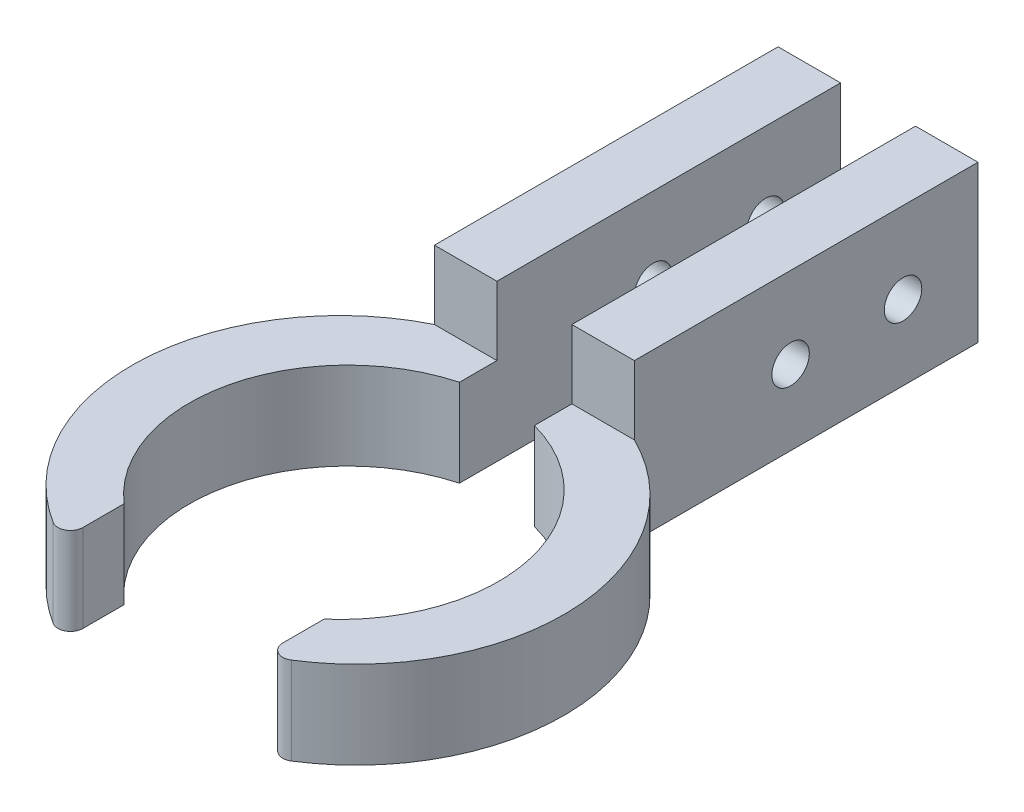
ISO-10303-21;
HEADER;
FILE_DESCRIPTION(('STEP AP214'),'2;1');
FILE_NAME('part.step','',(''),(''),'','','');
FILE_SCHEMA(('AUTOMOTIVE_DESIGN { 1 0 10303 214 1 1 1 1 }'));
ENDSEC;
DATA;
#1=APPLICATION_CONTEXT('core data for automotive mechanical design processes');
#2=APPLICATION_PROTOCOL_DEFINITION('international standard','automotive_design',2000,#1);
#3=PRODUCT_CONTEXT('',#1,'mechanical');
#4=PRODUCT('Part','Part','',(#3));
#5=PRODUCT_RELATED_PRODUCT_CATEGORY('part','',(#4));
#6=PRODUCT_DEFINITION_FORMATION('','',#4);
#7=PRODUCT_DEFINITION_CONTEXT('part definition',#1,'design');
#8=PRODUCT_DEFINITION('design','',#6,#7);
#9=PRODUCT_DEFINITION_SHAPE('','',#8);
#10=(LENGTH_UNIT() NAMED_UNIT(*) SI_UNIT(.MILLI.,.METRE.));
#11=(NAMED_UNIT(*) PLANE_ANGLE_UNIT() SI_UNIT($,.RADIAN.));
#12=(NAMED_UNIT(*) SI_UNIT($,.STERADIAN.) SOLID_ANGLE_UNIT());
#13=UNCERTAINTY_MEASURE_WITH_UNIT(LENGTH_MEASURE(1.E-05),#10,'distance_accuracy_value','');
#14=(GEOMETRIC_REPRESENTATION_CONTEXT(3) GLOBAL_UNCERTAINTY_ASSIGNED_CONTEXT((#13)) GLOBAL_UNIT_ASSIGNED_CONTEXT((#10,
#11,#12)) REPRESENTATION_CONTEXT('',''));
#15=CARTESIAN_POINT('',(0.,0.,0.));
#16=DIRECTION('',(0.,0.,1.));
#17=DIRECTION('',(1.,0.,0.));
#18=AXIS2_PLACEMENT_3D('',#15,#16,#17);
#19=CARTESIAN_POINT('',(5.18550460935479,7.,29.));
#20=DIRECTION('',(0.,-1.,0.));
#21=DIRECTION('',(0.,0.,-1.));
#22=AXIS2_PLACEMENT_3D('',#19,#20,#21);
#23=PLANE('',#22);
#24=DIRECTION('',(0.,0.,1.));
#25=VECTOR('',#24,1.);
#26=CARTESIAN_POINT('',(13.5,7.,38.5873638761418));
#27=LINE('',#26,#25);
#28=CARTESIAN_POINT('',(13.5,7.,38.5873638761418));
#29=VERTEX_POINT('',#28);
#30=CARTESIAN_POINT('',(13.5,7.,41.8828755037194));
#31=VERTEX_POINT('',#30);
#32=EDGE_CURVE('E156',#29,#31,#27,.T.);
#33=ORIENTED_EDGE('',*,*,#32,.T.);
#34=CARTESIAN_POINT('',(14.5,7.,41.8828755037194));
#35=DIRECTION('',(0.,-1.,0.));
#36=DIRECTION('',(0.,0.,-1.));
#37=AXIS2_PLACEMENT_3D('',#34,#35,#36);
#38=CIRCLE('',#37,1.);
#39=CARTESIAN_POINT('',(15.0340292748138,7.,42.7283414898134));
#40=VERTEX_POINT('',#39);
#41=EDGE_CURVE('E12',#31,#40,#38,.F.);
#42=ORIENTED_EDGE('',*,*,#41,.T.);
#43=CARTESIAN_POINT('',(6.15340022759102,7.,28.6686819380709));
#44=DIRECTION('',(0.,1.,0.));
#45=DIRECTION('',(0.,0.,-1.));
#46=AXIS2_PLACEMENT_3D('',#43,#44,#45);
#47=CIRCLE('',#46,16.6294798170382);
#48=CARTESIAN_POINT('',(13.5,7.,13.75));
#49=VERTEX_POINT('',#48);
#50=EDGE_CURVE('E159',#40,#49,#47,.T.);
#51=ORIENTED_EDGE('',*,*,#50,.T.);
#52=DIRECTION('',(1.,0.,0.));
#53=VECTOR('',#52,1.);
#54=CARTESIAN_POINT('',(13.5,7.,13.75));
#55=LINE('',#54,#53);
#56=CARTESIAN_POINT('',(8.50000000000001,7.,13.75));
#57=VERTEX_POINT('',#56);
#58=EDGE_CURVE('E136',#57,#49,#55,.T.);
#59=ORIENTED_EDGE('',*,*,#58,.F.);
#60=DIRECTION('',(0.,0.,1.));
#61=VECTOR('',#60,1.);
#62=CARTESIAN_POINT('',(8.50000000000001,7.,13.75));
#63=LINE('',#62,#61);
#64=CARTESIAN_POINT('',(8.50000000000001,7.,16.75));
#65=VERTEX_POINT('',#64);
#66=EDGE_CURVE('E161',#57,#65,#63,.T.);
#67=ORIENTED_EDGE('',*,*,#66,.T.);
#68=CARTESIAN_POINT('',(5.18550460935479,7.,29.));
#69=DIRECTION('',(0.,-1.,0.));
#70=DIRECTION('',(0.,0.,-1.));
#71=AXIS2_PLACEMENT_3D('',#68,#69,#70);
#72=CIRCLE('',#71,12.6904838242917);
#73=EDGE_CURVE('E153',#65,#29,#72,.T.);
#74=ORIENTED_EDGE('',*,*,#73,.T.);
#75=EDGE_LOOP('',(#33,#42,#51,#59,#67,#74));
#76=FACE_BOUND('',#75,.T.);
#77=ADVANCED_FACE('F43',(#76),#23,.F.);
#78=CARTESIAN_POINT('',(5.18550460935479,7.,29.));
#79=DIRECTION('',(0.,-1.,0.));
#80=DIRECTION('',(0.,0.,-1.));
#81=AXIS2_PLACEMENT_3D('',#78,#79,#80);
#82=CYLINDRICAL_SURFACE('',#81,12.6904838242917);
#83=CARTESIAN_POINT('',(5.18550460935479,0.,29.));
#84=DIRECTION('',(0.,-1.,0.));
#85=DIRECTION('',(0.,0.,-1.));
#86=AXIS2_PLACEMENT_3D('',#83,#84,#85);
#87=CIRCLE('',#86,12.6904838242917);
#88=CARTESIAN_POINT('',(8.50000000000001,0.,16.75));
#89=VERTEX_POINT('',#88);
#90=CARTESIAN_POINT('',(13.5,0.,38.5873638761418));
#91=VERTEX_POINT('',#90);
#92=EDGE_CURVE('E152',#89,#91,#87,.T.);
#93=ORIENTED_EDGE('',*,*,#92,.T.);
#94=DIRECTION('',(0.,-1.,0.));
#95=VECTOR('',#94,1.);
#96=CARTESIAN_POINT('',(13.5,7.,38.5873638761418));
#97=LINE('',#96,#95);
#98=EDGE_CURVE('E178',#29,#91,#97,.T.);
#99=ORIENTED_EDGE('',*,*,#98,.F.);
#100=ORIENTED_EDGE('',*,*,#73,.F.);
#101=DIRECTION('',(0.,-1.,0.));
#102=VECTOR('',#101,1.);
#103=CARTESIAN_POINT('',(8.50000000000001,7.,16.75));
#104=LINE('',#103,#102);
#105=EDGE_CURVE('E163',#65,#89,#104,.T.);
#106=ORIENTED_EDGE('',*,*,#105,.T.);
#107=EDGE_LOOP('',(#93,#99,#100,#106));
#108=FACE_BOUND('',#107,.T.);
#109=ADVANCED_FACE('F216',(#108),#82,.F.);
#110=CARTESIAN_POINT('',(13.5,7.,38.5873638761418));
#111=DIRECTION('',(1.,0.,0.));
#112=DIRECTION('',(0.,0.,-1.));
#113=AXIS2_PLACEMENT_3D('',#110,#111,#112);
#114=PLANE('',#113);
#115=DIRECTION('',(0.,0.,1.));
#116=VECTOR('',#115,1.);
#117=CARTESIAN_POINT('',(13.5,0.,38.5873638761418));
#118=LINE('',#117,#116);
#119=CARTESIAN_POINT('',(13.5,0.,41.8828755037194));
#120=VERTEX_POINT('',#119);
#121=EDGE_CURVE('E166',#91,#120,#118,.T.);
#122=ORIENTED_EDGE('',*,*,#121,.T.);
#123=DIRECTION('',(0.,-1.,0.));
#124=VECTOR('',#123,1.);
#125=CARTESIAN_POINT('',(13.5,7.,41.8828755037194));
#126=LINE('',#125,#124);
#127=EDGE_CURVE('E51',#120,#31,#126,.F.);
#128=ORIENTED_EDGE('',*,*,#127,.T.);
#129=ORIENTED_EDGE('',*,*,#32,.F.);
#130=ORIENTED_EDGE('',*,*,#98,.T.);
#131=EDGE_LOOP('',(#122,#128,#129,#130));
#132=FACE_BOUND('',#131,.T.);
#133=ADVANCED_FACE('F221',(#132),#114,.F.);
#134=CARTESIAN_POINT('',(6.15340022759102,7.,28.6686819380709));
#135=DIRECTION('',(0.,-1.,0.));
#136=DIRECTION('',(0.,0.,-1.));
#137=AXIS2_PLACEMENT_3D('',#134,#135,#136);
#138=CYLINDRICAL_SURFACE('',#137,16.6294798170382);
#139=ORIENTED_EDGE('',*,*,#50,.F.);
#140=DIRECTION('',(0.,-1.,0.));
#141=VECTOR('',#140,1.);
#142=CARTESIAN_POINT('',(15.0340292748138,7.,42.7283414898134));
#143=LINE('',#142,#141);
#144=CARTESIAN_POINT('',(15.0340292748138,0.,42.7283414898134));
#145=VERTEX_POINT('',#144);
#146=EDGE_CURVE('E181',#40,#145,#143,.T.);
#147=ORIENTED_EDGE('',*,*,#146,.T.);
#148=CARTESIAN_POINT('',(6.15340022759102,0.,28.6686819380709));
#149=DIRECTION('',(0.,1.,0.));
#150=DIRECTION('',(0.,0.,-1.));
#151=AXIS2_PLACEMENT_3D('',#148,#149,#150);
#152=CIRCLE('',#151,16.6294798170382);
#153=CARTESIAN_POINT('',(13.5,0.,13.75));
#154=VERTEX_POINT('',#153);
#155=EDGE_CURVE('E168',#145,#154,#152,.T.);
#156=ORIENTED_EDGE('',*,*,#155,.T.);
#157=DIRECTION('',(0.,-1.,0.));
#158=VECTOR('',#157,1.);
#159=CARTESIAN_POINT('',(13.5,7.,13.75));
#160=LINE('',#159,#158);
#161=EDGE_CURVE('E121',#49,#154,#160,.T.);
#162=ORIENTED_EDGE('',*,*,#161,.F.);
#163=EDGE_LOOP('',(#139,#147,#156,#162));
#164=FACE_BOUND('',#163,.T.);
#165=ADVANCED_FACE('F193',(#164),#138,.T.);
#166=CARTESIAN_POINT('',(13.5,7.,13.75));
#167=DIRECTION('',(-1.,0.,0.));
#168=DIRECTION('',(0.,0.,1.));
#169=AXIS2_PLACEMENT_3D('',#166,#167,#168);
#170=PLANE('',#169);
#171=CARTESIAN_POINT('',(13.5,6.,-7.75));
#172=DIRECTION('',(1.,0.,0.));
#173=DIRECTION('',(0.,0.,-1.));
#174=AXIS2_PLACEMENT_3D('',#171,#172,#173);
#175=CIRCLE('',#174,1.5);
#176=CARTESIAN_POINT('',(13.5,6.,-9.25));
#177=VERTEX_POINT('',#176);
#178=EDGE_CURVE('E185',#177,#177,#175,.T.);
#179=ORIENTED_EDGE('',*,*,#178,.F.);
#180=EDGE_LOOP('',(#179));
#181=FACE_BOUND('',#180,.T.);
#182=CARTESIAN_POINT('',(13.5,6.,1.25));
#183=DIRECTION('',(1.,0.,0.));
#184=DIRECTION('',(0.,0.,-1.));
#185=AXIS2_PLACEMENT_3D('',#182,#183,#184);
#186=CIRCLE('',#185,1.5);
#187=CARTESIAN_POINT('',(13.5,6.,-0.250000000000001));
#188=VERTEX_POINT('',#187);
#189=EDGE_CURVE('E142',#188,#188,#186,.T.);
#190=ORIENTED_EDGE('',*,*,#189,.F.);
#191=EDGE_LOOP('',(#190));
#192=FACE_BOUND('',#191,.T.);
#193=DIRECTION('',(0.,0.,-1.));
#194=VECTOR('',#193,1.);
#195=CARTESIAN_POINT('',(13.5,0.,13.75));
#196=LINE('',#195,#194);
#197=CARTESIAN_POINT('',(13.5,0.,-13.75));
#198=VERTEX_POINT('',#197);
#199=EDGE_CURVE('E117',#154,#198,#196,.T.);
#200=ORIENTED_EDGE('',*,*,#199,.T.);
#201=DIRECTION('',(0.,-1.,0.));
#202=VECTOR('',#201,1.);
#203=CARTESIAN_POINT('',(13.5,7.,-13.75));
#204=LINE('',#203,#202);
#205=CARTESIAN_POINT('',(13.5,12.5,-13.75));
#206=VERTEX_POINT('',#205);
#207=EDGE_CURVE('E109',#206,#198,#204,.T.);
#208=ORIENTED_EDGE('',*,*,#207,.F.);
#209=DIRECTION('',(0.,0.,-1.));
#210=VECTOR('',#209,1.);
#211=CARTESIAN_POINT('',(13.5,12.5,13.75));
#212=LINE('',#211,#210);
#213=CARTESIAN_POINT('',(13.5,12.5,13.75));
#214=VERTEX_POINT('',#213);
#215=EDGE_CURVE('E114',#214,#206,#212,.T.);
#216=ORIENTED_EDGE('',*,*,#215,.F.);
#217=DIRECTION('',(0.,-1.,0.));
#218=VECTOR('',#217,1.);
#219=CARTESIAN_POINT('',(13.5,12.5,13.75));
#220=LINE('',#219,#218);
#221=EDGE_CURVE('E146',#214,#49,#220,.T.);
#222=ORIENTED_EDGE('',*,*,#221,.T.);
#223=ORIENTED_EDGE('',*,*,#161,.T.);
#224=EDGE_LOOP('',(#200,#208,#216,#222,#223));
#225=FACE_BOUND('',#224,.T.);
#226=ADVANCED_FACE('F111',(#181,#192,#225),#170,.F.);
#227=CARTESIAN_POINT('',(13.5,7.,-13.75));
#228=DIRECTION('',(0.,0.,1.));
#229=DIRECTION('',(1.,0.,0.));
#230=AXIS2_PLACEMENT_3D('',#227,#228,#229);
#231=PLANE('',#230);
#232=DIRECTION('',(-1.,0.,0.));
#233=VECTOR('',#232,1.);
#234=CARTESIAN_POINT('',(13.5,0.,-13.75));
#235=LINE('',#234,#233);
#236=CARTESIAN_POINT('',(8.5,0.,-13.75));
#237=VERTEX_POINT('',#236);
#238=EDGE_CURVE('E171',#198,#237,#235,.T.);
#239=ORIENTED_EDGE('',*,*,#238,.T.);
#240=DIRECTION('',(0.,-1.,0.));
#241=VECTOR('',#240,1.);
#242=CARTESIAN_POINT('',(8.5,7.,-13.75));
#243=LINE('',#242,#241);
#244=CARTESIAN_POINT('',(8.5,12.5,-13.75));
#245=VERTEX_POINT('',#244);
#246=EDGE_CURVE('E122',#245,#237,#243,.T.);
#247=ORIENTED_EDGE('',*,*,#246,.F.);
#248=DIRECTION('',(-1.,0.,0.));
#249=VECTOR('',#248,1.);
#250=CARTESIAN_POINT('',(13.5,12.5,-13.75));
#251=LINE('',#250,#249);
#252=EDGE_CURVE('E125',#206,#245,#251,.T.);
#253=ORIENTED_EDGE('',*,*,#252,.F.);
#254=ORIENTED_EDGE('',*,*,#207,.T.);
#255=EDGE_LOOP('',(#239,#247,#253,#254));
#256=FACE_BOUND('',#255,.T.);
#257=ADVANCED_FACE('F126',(#256),#231,.F.);
#258=CARTESIAN_POINT('',(8.50000000000001,7.,13.75));
#259=DIRECTION('',(1.,0.,0.));
#260=DIRECTION('',(0.,0.,-1.));
#261=AXIS2_PLACEMENT_3D('',#258,#259,#260);
#262=PLANE('',#261);
#263=CARTESIAN_POINT('',(8.50000000000001,6.,-7.75));
#264=DIRECTION('',(1.,0.,0.));
#265=DIRECTION('',(0.,0.,-1.));
#266=AXIS2_PLACEMENT_3D('',#263,#264,#265);
#267=CIRCLE('',#266,1.5);
#268=CARTESIAN_POINT('',(8.50000000000001,6.,-9.25));
#269=VERTEX_POINT('',#268);
#270=EDGE_CURVE('E139',#269,#269,#267,.T.);
#271=ORIENTED_EDGE('',*,*,#270,.T.);
#272=EDGE_LOOP('',(#271));
#273=FACE_BOUND('',#272,.T.);
#274=CARTESIAN_POINT('',(8.50000000000001,6.,1.25));
#275=DIRECTION('',(1.,0.,0.));
#276=DIRECTION('',(0.,0.,-1.));
#277=AXIS2_PLACEMENT_3D('',#274,#275,#276);
#278=CIRCLE('',#277,1.5);
#279=CARTESIAN_POINT('',(8.50000000000001,6.,-0.25));
#280=VERTEX_POINT('',#279);
#281=EDGE_CURVE('E182',#280,#280,#278,.T.);
#282=ORIENTED_EDGE('',*,*,#281,.T.);
#283=EDGE_LOOP('',(#282));
#284=FACE_BOUND('',#283,.T.);
#285=DIRECTION('',(0.,0.,1.));
#286=VECTOR('',#285,1.);
#287=CARTESIAN_POINT('',(8.50000000000001,0.,13.75));
#288=LINE('',#287,#286);
#289=EDGE_CURVE('E157',#237,#89,#288,.T.);
#290=ORIENTED_EDGE('',*,*,#289,.T.);
#291=ORIENTED_EDGE('',*,*,#105,.F.);
#292=ORIENTED_EDGE('',*,*,#66,.F.);
#293=DIRECTION('',(0.,-1.,0.));
#294=VECTOR('',#293,1.);
#295=CARTESIAN_POINT('',(8.5,12.5,13.75));
#296=LINE('',#295,#294);
#297=CARTESIAN_POINT('',(8.5,12.5,13.75));
#298=VERTEX_POINT('',#297);
#299=EDGE_CURVE('E149',#298,#57,#296,.T.);
#300=ORIENTED_EDGE('',*,*,#299,.F.);
#301=DIRECTION('',(0.,0.,1.));
#302=VECTOR('',#301,1.);
#303=CARTESIAN_POINT('',(8.5,12.5,13.75));
#304=LINE('',#303,#302);
#305=EDGE_CURVE('E130',#245,#298,#304,.T.);
#306=ORIENTED_EDGE('',*,*,#305,.F.);
#307=ORIENTED_EDGE('',*,*,#246,.T.);
#308=EDGE_LOOP('',(#290,#291,#292,#300,#306,#307));
#309=FACE_BOUND('',#308,.T.);
#310=ADVANCED_FACE('F200',(#273,#284,#309),#262,.F.);
#311=CARTESIAN_POINT('',(5.18550460935479,0.,29.));
#312=DIRECTION('',(0.,-1.,0.));
#313=DIRECTION('',(0.,0.,-1.));
#314=AXIS2_PLACEMENT_3D('',#311,#312,#313);
#315=PLANE('',#314);
#316=ORIENTED_EDGE('',*,*,#155,.F.);
#317=CARTESIAN_POINT('',(14.5,0.,41.8828755037194));
#318=DIRECTION('',(0.,-1.,0.));
#319=DIRECTION('',(0.,0.,-1.));
#320=AXIS2_PLACEMENT_3D('',#317,#318,#319);
#321=CIRCLE('',#320,1.);
#322=EDGE_CURVE('E65',#145,#120,#321,.T.);
#323=ORIENTED_EDGE('',*,*,#322,.T.);
#324=ORIENTED_EDGE('',*,*,#121,.F.);
#325=ORIENTED_EDGE('',*,*,#92,.F.);
#326=ORIENTED_EDGE('',*,*,#289,.F.);
#327=ORIENTED_EDGE('',*,*,#238,.F.);
#328=ORIENTED_EDGE('',*,*,#199,.F.);
#329=EDGE_LOOP('',(#316,#323,#324,#325,#326,#327,#328));
#330=FACE_BOUND('',#329,.T.);
#331=ADVANCED_FACE('F197',(#330),#315,.T.);
#332=CARTESIAN_POINT('',(13.5,12.5,13.75));
#333=DIRECTION('',(0.,0.,-1.));
#334=DIRECTION('',(-1.,0.,0.));
#335=AXIS2_PLACEMENT_3D('',#332,#333,#334);
#336=PLANE('',#335);
#337=ORIENTED_EDGE('',*,*,#58,.T.);
#338=ORIENTED_EDGE('',*,*,#221,.F.);
#339=DIRECTION('',(1.,0.,0.));
#340=VECTOR('',#339,1.);
#341=CARTESIAN_POINT('',(13.5,12.5,13.75));
#342=LINE('',#341,#340);
#343=EDGE_CURVE('E134',#298,#214,#342,.T.);
#344=ORIENTED_EDGE('',*,*,#343,.F.);
#345=ORIENTED_EDGE('',*,*,#299,.T.);
#346=EDGE_LOOP('',(#337,#338,#344,#345));
#347=FACE_BOUND('',#346,.T.);
#348=ADVANCED_FACE('F205',(#347),#336,.F.);
#349=CARTESIAN_POINT('',(0.,12.5,0.));
#350=DIRECTION('',(0.,1.,0.));
#351=DIRECTION('',(0.,0.,1.));
#352=AXIS2_PLACEMENT_3D('',#349,#350,#351);
#353=PLANE('',#352);
#354=ORIENTED_EDGE('',*,*,#215,.T.);
#355=ORIENTED_EDGE('',*,*,#252,.T.);
#356=ORIENTED_EDGE('',*,*,#305,.T.);
#357=ORIENTED_EDGE('',*,*,#343,.T.);
#358=EDGE_LOOP('',(#354,#355,#356,#357));
#359=FACE_BOUND('',#358,.T.);
#360=ADVANCED_FACE('F132',(#359),#353,.T.);
#361=CARTESIAN_POINT('',(-6.74264068711928,6.,1.25));
#362=DIRECTION('',(1.,0.,0.));
#363=DIRECTION('',(0.,0.,-1.));
#364=AXIS2_PLACEMENT_3D('',#361,#362,#363);
#365=CYLINDRICAL_SURFACE('',#364,1.5);
#366=ORIENTED_EDGE('',*,*,#189,.T.);
#367=EDGE_LOOP('',(#366));
#368=FACE_BOUND('',#367,.T.);
#369=ORIENTED_EDGE('',*,*,#281,.F.);
#370=EDGE_LOOP('',(#369));
#371=FACE_BOUND('',#370,.T.);
#372=ADVANCED_FACE('F212',(#368,#371),#365,.F.);
#373=CARTESIAN_POINT('',(-6.74264068711929,6.,-7.74999999999999));
#374=DIRECTION('',(1.,0.,0.));
#375=DIRECTION('',(0.,0.,-1.));
#376=AXIS2_PLACEMENT_3D('',#373,#374,#375);
#377=CYLINDRICAL_SURFACE('',#376,1.5);
#378=ORIENTED_EDGE('',*,*,#178,.T.);
#379=EDGE_LOOP('',(#378));
#380=FACE_BOUND('',#379,.T.);
#381=ORIENTED_EDGE('',*,*,#270,.F.);
#382=EDGE_LOOP('',(#381));
#383=FACE_BOUND('',#382,.T.);
#384=ADVANCED_FACE('F208',(#380,#383),#377,.F.);
#385=CARTESIAN_POINT('',(14.5,7.,41.8828755037194));
#386=DIRECTION('',(0.,-1.,0.));
#387=DIRECTION('',(0.,0.,-1.));
#388=AXIS2_PLACEMENT_3D('',#385,#386,#387);
#389=CYLINDRICAL_SURFACE('',#388,1.);
#390=ORIENTED_EDGE('',*,*,#41,.F.);
#391=ORIENTED_EDGE('',*,*,#127,.F.);
#392=ORIENTED_EDGE('',*,*,#322,.F.);
#393=ORIENTED_EDGE('',*,*,#146,.F.);
#394=EDGE_LOOP('',(#390,#391,#392,#393));
#395=FACE_BOUND('',#394,.T.);
#396=ADVANCED_FACE('F45',(#395),#389,.T.);
#397=CLOSED_SHELL('',(#77,#109,#133,#165,#226,#257,#310,#331,#348,#360,#372,#384,#396));
#398=MANIFOLD_SOLID_BREP('B2',#397);
#399=CARTESIAN_POINT('',(-2.5,7.,-13.75));
#400=DIRECTION('',(0.,0.,1.));
#401=DIRECTION('',(1.,0.,0.));
#402=AXIS2_PLACEMENT_3D('',#399,#400,#401);
#403=PLANE('',#402);
#404=DIRECTION('',(-1.,0.,0.));
#405=VECTOR('',#404,1.);
#406=CARTESIAN_POINT('',(-2.5,0.,-13.75));
#407=LINE('',#406,#405);
#408=CARTESIAN_POINT('',(2.5,0.,-13.75));
#409=VERTEX_POINT('',#408);
#410=CARTESIAN_POINT('',(-2.5,0.,-13.75));
#411=VERTEX_POINT('',#410);
#412=EDGE_CURVE('E440',#409,#411,#407,.T.);
#413=ORIENTED_EDGE('',*,*,#412,.T.);
#414=DIRECTION('',(0.,-1.,0.));
#415=VECTOR('',#414,1.);
#416=CARTESIAN_POINT('',(-2.5,7.,-13.75));
#417=LINE('',#416,#415);
#418=CARTESIAN_POINT('',(-2.5,12.5,-13.75));
#419=VERTEX_POINT('',#418);
#420=EDGE_CURVE('E472',#419,#411,#417,.T.);
#421=ORIENTED_EDGE('',*,*,#420,.F.);
#422=DIRECTION('',(-1.,0.,0.));
#423=VECTOR('',#422,1.);
#424=CARTESIAN_POINT('',(-2.5,12.5,-13.75));
#425=LINE('',#424,#423);
#426=CARTESIAN_POINT('',(2.5,12.5,-13.75));
#427=VERTEX_POINT('',#426);
#428=EDGE_CURVE('E431',#427,#419,#425,.T.);
#429=ORIENTED_EDGE('',*,*,#428,.F.);
#430=DIRECTION('',(0.,-1.,0.));
#431=VECTOR('',#430,1.);
#432=CARTESIAN_POINT('',(2.5,7.,-13.75));
#433=LINE('',#432,#431);
#434=EDGE_CURVE('E474',#427,#409,#433,.T.);
#435=ORIENTED_EDGE('',*,*,#434,.T.);
#436=EDGE_LOOP('',(#413,#421,#429,#435));
#437=FACE_BOUND('',#436,.T.);
#438=ADVANCED_FACE('F345',(#437),#403,.F.);
#439=CARTESIAN_POINT('',(-2.5,7.,13.75));
#440=DIRECTION('',(1.,0.,0.));
#441=DIRECTION('',(0.,0.,-1.));
#442=AXIS2_PLACEMENT_3D('',#439,#440,#441);
#443=PLANE('',#442);
#444=CARTESIAN_POINT('',(-2.5,6.,-7.75));
#445=DIRECTION('',(1.,0.,0.));
#446=DIRECTION('',(0.,0.,-1.));
#447=AXIS2_PLACEMENT_3D('',#444,#445,#446);
#448=CIRCLE('',#447,1.5);
#449=CARTESIAN_POINT('',(-2.5,6.,-9.25));
#450=VERTEX_POINT('',#449);
#451=EDGE_CURVE('E482',#450,#450,#448,.F.);
#452=ORIENTED_EDGE('',*,*,#451,.F.);
#453=EDGE_LOOP('',(#452));
#454=FACE_BOUND('',#453,.T.);
#455=CARTESIAN_POINT('',(-2.5,6.,1.25));
#456=DIRECTION('',(1.,0.,0.));
#457=DIRECTION('',(0.,0.,-1.));
#458=AXIS2_PLACEMENT_3D('',#455,#456,#457);
#459=CIRCLE('',#458,1.5);
#460=CARTESIAN_POINT('',(-2.5,6.,-0.249999999999997));
#461=VERTEX_POINT('',#460);
#462=EDGE_CURVE('E547',#461,#461,#459,.F.);
#463=ORIENTED_EDGE('',*,*,#462,.F.);
#464=EDGE_LOOP('',(#463));
#465=FACE_BOUND('',#464,.T.);
#466=DIRECTION('',(0.,0.,1.));
#467=VECTOR('',#466,1.);
#468=CARTESIAN_POINT('',(-2.5,0.,13.75));
#469=LINE('',#468,#467);
#470=CARTESIAN_POINT('',(-2.5,0.,13.75));
#471=VERTEX_POINT('',#470);
#472=EDGE_CURVE('E442',#411,#471,#469,.T.);
#473=ORIENTED_EDGE('',*,*,#472,.T.);
#474=DIRECTION('',(0.,-1.,0.));
#475=VECTOR('',#474,1.);
#476=CARTESIAN_POINT('',(-2.5,7.,13.75));
#477=LINE('',#476,#475);
#478=CARTESIAN_POINT('',(-2.5,7.,13.75));
#479=VERTEX_POINT('',#478);
#480=EDGE_CURVE('E439',#479,#471,#477,.T.);
#481=ORIENTED_EDGE('',*,*,#480,.F.);
#482=DIRECTION('',(0.,-1.,0.));
#483=VECTOR('',#482,1.);
#484=CARTESIAN_POINT('',(-2.5,12.5,13.75));
#485=LINE('',#484,#483);
#486=CARTESIAN_POINT('',(-2.5,12.5,13.75));
#487=VERTEX_POINT('',#486);
#488=EDGE_CURVE('E418',#487,#479,#485,.T.);
#489=ORIENTED_EDGE('',*,*,#488,.F.);
#490=DIRECTION('',(0.,0.,1.));
#491=VECTOR('',#490,1.);
#492=CARTESIAN_POINT('',(-2.5,12.5,13.75));
#493=LINE('',#492,#491);
#494=EDGE_CURVE('E425',#419,#487,#493,.T.);
#495=ORIENTED_EDGE('',*,*,#494,.F.);
#496=ORIENTED_EDGE('',*,*,#420,.T.);
#497=EDGE_LOOP('',(#473,#481,#489,#495,#496));
#498=FACE_BOUND('',#497,.T.);
#499=ADVANCED_FACE('F437',(#454,#465,#498),#443,.F.);
#500=CARTESIAN_POINT('',(4.84659977240899,7.,28.6686819380709));
#501=DIRECTION('',(0.,-1.,0.));
#502=DIRECTION('',(0.,0.,-1.));
#503=AXIS2_PLACEMENT_3D('',#500,#501,#502);
#504=CYLINDRICAL_SURFACE('',#503,16.6294798170382);
#505=CARTESIAN_POINT('',(4.84659977240899,0.,28.6686819380709));
#506=DIRECTION('',(0.,1.,0.));
#507=DIRECTION('',(0.,0.,1.));
#508=AXIS2_PLACEMENT_3D('',#505,#506,#507);
#509=CIRCLE('',#508,16.6294798170382);
#510=CARTESIAN_POINT('',(-4.03402927481374,0.,42.7283414898134));
#511=VERTEX_POINT('',#510);
#512=EDGE_CURVE('E459',#471,#511,#509,.T.);
#513=ORIENTED_EDGE('',*,*,#512,.T.);
#514=DIRECTION('',(0.,-1.,0.));
#515=VECTOR('',#514,1.);
#516=CARTESIAN_POINT('',(-4.03402927481375,7.,42.7283414898134));
#517=LINE('',#516,#515);
#518=CARTESIAN_POINT('',(-4.03402927481374,7.,42.7283414898134));
#519=VERTEX_POINT('',#518);
#520=EDGE_CURVE('E353',#511,#519,#517,.F.);
#521=ORIENTED_EDGE('',*,*,#520,.T.);
#522=CARTESIAN_POINT('',(4.84659977240899,7.,28.6686819380709));
#523=DIRECTION('',(0.,1.,0.));
#524=DIRECTION('',(0.,0.,1.));
#525=AXIS2_PLACEMENT_3D('',#522,#523,#524);
#526=CIRCLE('',#525,16.6294798170382);
#527=EDGE_CURVE('E449',#479,#519,#526,.T.);
#528=ORIENTED_EDGE('',*,*,#527,.F.);
#529=ORIENTED_EDGE('',*,*,#480,.T.);
#530=EDGE_LOOP('',(#513,#521,#528,#529));
#531=FACE_BOUND('',#530,.T.);
#532=ADVANCED_FACE('F519',(#531),#504,.T.);
#533=CARTESIAN_POINT('',(-2.5,7.,38.5873638761418));
#534=DIRECTION('',(-1.,0.,0.));
#535=DIRECTION('',(0.,0.,1.));
#536=AXIS2_PLACEMENT_3D('',#533,#534,#535);
#537=PLANE('',#536);
#538=DIRECTION('',(0.,0.,-1.));
#539=VECTOR('',#538,1.);
#540=CARTESIAN_POINT('',(-2.5,7.,38.5873638761418));
#541=LINE('',#540,#539);
#542=CARTESIAN_POINT('',(-2.5,7.,41.8828755037194));
#543=VERTEX_POINT('',#542);
#544=CARTESIAN_POINT('',(-2.5,7.,38.5873638761418));
#545=VERTEX_POINT('',#544);
#546=EDGE_CURVE('E452',#543,#545,#541,.T.);
#547=ORIENTED_EDGE('',*,*,#546,.F.);
#548=DIRECTION('',(0.,-1.,0.));
#549=VECTOR('',#548,1.);
#550=CARTESIAN_POINT('',(-2.5,7.,41.8828755037194));
#551=LINE('',#550,#549);
#552=CARTESIAN_POINT('',(-2.5,0.,41.8828755037194));
#553=VERTEX_POINT('',#552);
#554=EDGE_CURVE('E477',#543,#553,#551,.T.);
#555=ORIENTED_EDGE('',*,*,#554,.T.);
#556=DIRECTION('',(0.,0.,-1.));
#557=VECTOR('',#556,1.);
#558=CARTESIAN_POINT('',(-2.5,0.,38.5873638761418));
#559=LINE('',#558,#557);
#560=CARTESIAN_POINT('',(-2.5,0.,38.5873638761418));
#561=VERTEX_POINT('',#560);
#562=EDGE_CURVE('E461',#553,#561,#559,.T.);
#563=ORIENTED_EDGE('',*,*,#562,.T.);
#564=DIRECTION('',(0.,-1.,0.));
#565=VECTOR('',#564,1.);
#566=CARTESIAN_POINT('',(-2.5,7.,38.5873638761418));
#567=LINE('',#566,#565);
#568=EDGE_CURVE('E468',#545,#561,#567,.T.);
#569=ORIENTED_EDGE('',*,*,#568,.F.);
#570=EDGE_LOOP('',(#547,#555,#563,#569));
#571=FACE_BOUND('',#570,.T.);
#572=ADVANCED_FACE('F490',(#571),#537,.F.);
#573=CARTESIAN_POINT('',(5.81449539064522,7.,29.));
#574=DIRECTION('',(0.,-1.,0.));
#575=DIRECTION('',(0.,0.,-1.));
#576=AXIS2_PLACEMENT_3D('',#573,#574,#575);
#577=CYLINDRICAL_SURFACE('',#576,12.6904838242917);
#578=CARTESIAN_POINT('',(5.81449539064522,0.,29.));
#579=DIRECTION('',(0.,-1.,0.));
#580=DIRECTION('',(0.,0.,1.));
#581=AXIS2_PLACEMENT_3D('',#578,#579,#580);
#582=CIRCLE('',#581,12.6904838242917);
#583=CARTESIAN_POINT('',(2.5,0.,16.75));
#584=VERTEX_POINT('',#583);
#585=EDGE_CURVE('E463',#561,#584,#582,.T.);
#586=ORIENTED_EDGE('',*,*,#585,.T.);
#587=DIRECTION('',(0.,-1.,0.));
#588=VECTOR('',#587,1.);
#589=CARTESIAN_POINT('',(2.5,7.,16.75));
#590=LINE('',#589,#588);
#591=CARTESIAN_POINT('',(2.5,7.,16.75));
#592=VERTEX_POINT('',#591);
#593=EDGE_CURVE('E456',#592,#584,#590,.T.);
#594=ORIENTED_EDGE('',*,*,#593,.F.);
#595=CARTESIAN_POINT('',(5.81449539064522,7.,29.));
#596=DIRECTION('',(0.,-1.,0.));
#597=DIRECTION('',(0.,0.,1.));
#598=AXIS2_PLACEMENT_3D('',#595,#596,#597);
#599=CIRCLE('',#598,12.6904838242917);
#600=EDGE_CURVE('E454',#545,#592,#599,.T.);
#601=ORIENTED_EDGE('',*,*,#600,.F.);
#602=ORIENTED_EDGE('',*,*,#568,.T.);
#603=EDGE_LOOP('',(#586,#594,#601,#602));
#604=FACE_BOUND('',#603,.T.);
#605=ADVANCED_FACE('F500',(#604),#577,.F.);
#606=CARTESIAN_POINT('',(2.5,7.,13.75));
#607=DIRECTION('',(-1.,0.,0.));
#608=DIRECTION('',(0.,0.,1.));
#609=AXIS2_PLACEMENT_3D('',#606,#607,#608);
#610=PLANE('',#609);
#611=CARTESIAN_POINT('',(2.49999999999999,6.,-7.75));
#612=DIRECTION('',(-1.,0.,0.));
#613=DIRECTION('',(0.,0.,1.));
#614=AXIS2_PLACEMENT_3D('',#611,#612,#613);
#615=CIRCLE('',#614,1.5);
#616=CARTESIAN_POINT('',(2.49999999999999,6.,-6.25));
#617=VERTEX_POINT('',#616);
#618=EDGE_CURVE('E481',#617,#617,#615,.T.);
#619=ORIENTED_EDGE('',*,*,#618,.T.);
#620=EDGE_LOOP('',(#619));
#621=FACE_BOUND('',#620,.T.);
#622=CARTESIAN_POINT('',(2.5,6.,1.25));
#623=DIRECTION('',(-1.,0.,0.));
#624=DIRECTION('',(0.,0.,1.));
#625=AXIS2_PLACEMENT_3D('',#622,#623,#624);
#626=CIRCLE('',#625,1.5);
#627=CARTESIAN_POINT('',(2.5,6.,2.75));
#628=VERTEX_POINT('',#627);
#629=EDGE_CURVE('E478',#628,#628,#626,.T.);
#630=ORIENTED_EDGE('',*,*,#629,.T.);
#631=EDGE_LOOP('',(#630));
#632=FACE_BOUND('',#631,.T.);
#633=DIRECTION('',(0.,0.,-1.));
#634=VECTOR('',#633,1.);
#635=CARTESIAN_POINT('',(2.5,0.,13.75));
#636=LINE('',#635,#634);
#637=EDGE_CURVE('E450',#584,#409,#636,.T.);
#638=ORIENTED_EDGE('',*,*,#637,.T.);
#639=ORIENTED_EDGE('',*,*,#434,.F.);
#640=DIRECTION('',(0.,0.,-1.));
#641=VECTOR('',#640,1.);
#642=CARTESIAN_POINT('',(2.5,12.5,13.75));
#643=LINE('',#642,#641);
#644=CARTESIAN_POINT('',(2.5,12.5,13.75));
#645=VERTEX_POINT('',#644);
#646=EDGE_CURVE('E424',#645,#427,#643,.T.);
#647=ORIENTED_EDGE('',*,*,#646,.F.);
#648=DIRECTION('',(0.,-1.,0.));
#649=VECTOR('',#648,1.);
#650=CARTESIAN_POINT('',(2.5,12.5,13.75));
#651=LINE('',#650,#649);
#652=CARTESIAN_POINT('',(2.5,7.,13.75));
#653=VERTEX_POINT('',#652);
#654=EDGE_CURVE('E420',#645,#653,#651,.T.);
#655=ORIENTED_EDGE('',*,*,#654,.T.);
#656=DIRECTION('',(0.,0.,-1.));
#657=VECTOR('',#656,1.);
#658=CARTESIAN_POINT('',(2.5,7.,13.75));
#659=LINE('',#658,#657);
#660=EDGE_CURVE('E447',#592,#653,#659,.T.);
#661=ORIENTED_EDGE('',*,*,#660,.F.);
#662=ORIENTED_EDGE('',*,*,#593,.T.);
#663=EDGE_LOOP('',(#638,#639,#647,#655,#661,#662));
#664=FACE_BOUND('',#663,.T.);
#665=ADVANCED_FACE('F503',(#621,#632,#664),#610,.F.);
#666=CARTESIAN_POINT('',(4.84659977240899,7.,28.6686819380709));
#667=DIRECTION('',(0.,1.,0.));
#668=DIRECTION('',(0.,0.,1.));
#669=AXIS2_PLACEMENT_3D('',#666,#667,#668);
#670=PLANE('',#669);
#671=ORIENTED_EDGE('',*,*,#527,.T.);
#672=CARTESIAN_POINT('',(-3.5,7.,41.8828755037194));
#673=DIRECTION('',(0.,1.,0.));
#674=DIRECTION('',(0.,0.,1.));
#675=AXIS2_PLACEMENT_3D('',#672,#673,#674);
#676=CIRCLE('',#675,1.);
#677=EDGE_CURVE('E41',#519,#543,#676,.T.);
#678=ORIENTED_EDGE('',*,*,#677,.T.);
#679=ORIENTED_EDGE('',*,*,#546,.T.);
#680=ORIENTED_EDGE('',*,*,#600,.T.);
#681=ORIENTED_EDGE('',*,*,#660,.T.);
#682=DIRECTION('',(1.,0.,0.));
#683=VECTOR('',#682,1.);
#684=CARTESIAN_POINT('',(-2.5,7.,13.75));
#685=LINE('',#684,#683);
#686=EDGE_CURVE('E434',#479,#653,#685,.T.);
#687=ORIENTED_EDGE('',*,*,#686,.F.);
#688=EDGE_LOOP('',(#671,#678,#679,#680,#681,#687));
#689=FACE_BOUND('',#688,.T.);
#690=ADVANCED_FACE('F505',(#689),#670,.T.);
#691=CARTESIAN_POINT('',(4.84659977240899,0.,28.6686819380709));
#692=DIRECTION('',(0.,1.,0.));
#693=DIRECTION('',(0.,0.,1.));
#694=AXIS2_PLACEMENT_3D('',#691,#692,#693);
#695=PLANE('',#694);
#696=ORIENTED_EDGE('',*,*,#562,.F.);
#697=CARTESIAN_POINT('',(-3.5,0.,41.8828755037194));
#698=DIRECTION('',(0.,1.,0.));
#699=DIRECTION('',(0.,0.,1.));
#700=AXIS2_PLACEMENT_3D('',#697,#698,#699);
#701=CIRCLE('',#700,1.);
#702=EDGE_CURVE('E367',#553,#511,#701,.F.);
#703=ORIENTED_EDGE('',*,*,#702,.T.);
#704=ORIENTED_EDGE('',*,*,#512,.F.);
#705=ORIENTED_EDGE('',*,*,#472,.F.);
#706=ORIENTED_EDGE('',*,*,#412,.F.);
#707=ORIENTED_EDGE('',*,*,#637,.F.);
#708=ORIENTED_EDGE('',*,*,#585,.F.);
#709=EDGE_LOOP('',(#696,#703,#704,#705,#706,#707,#708));
#710=FACE_BOUND('',#709,.T.);
#711=ADVANCED_FACE('F495',(#710),#695,.F.);
#712=CARTESIAN_POINT('',(-2.5,12.5,13.75));
#713=DIRECTION('',(0.,0.,-1.));
#714=DIRECTION('',(-1.,0.,0.));
#715=AXIS2_PLACEMENT_3D('',#712,#713,#714);
#716=PLANE('',#715);
#717=ORIENTED_EDGE('',*,*,#686,.T.);
#718=ORIENTED_EDGE('',*,*,#654,.F.);
#719=DIRECTION('',(1.,0.,0.));
#720=VECTOR('',#719,1.);
#721=CARTESIAN_POINT('',(-2.5,12.5,13.75));
#722=LINE('',#721,#720);
#723=EDGE_CURVE('E413',#487,#645,#722,.T.);
#724=ORIENTED_EDGE('',*,*,#723,.F.);
#725=ORIENTED_EDGE('',*,*,#488,.T.);
#726=EDGE_LOOP('',(#717,#718,#724,#725));
#727=FACE_BOUND('',#726,.T.);
#728=ADVANCED_FACE('F416',(#727),#716,.F.);
#729=CARTESIAN_POINT('',(0.,12.5,0.));
#730=DIRECTION('',(0.,-1.,0.));
#731=DIRECTION('',(0.,0.,-1.));
#732=AXIS2_PLACEMENT_3D('',#729,#730,#731);
#733=PLANE('',#732);
#734=ORIENTED_EDGE('',*,*,#494,.T.);
#735=ORIENTED_EDGE('',*,*,#723,.T.);
#736=ORIENTED_EDGE('',*,*,#646,.T.);
#737=ORIENTED_EDGE('',*,*,#428,.T.);
#738=EDGE_LOOP('',(#734,#735,#736,#737));
#739=FACE_BOUND('',#738,.T.);
#740=ADVANCED_FACE('F429',(#739),#733,.F.);
#741=CARTESIAN_POINT('',(-6.74264068711928,6.,1.25));
#742=DIRECTION('',(1.,0.,0.));
#743=DIRECTION('',(0.,0.,-1.));
#744=AXIS2_PLACEMENT_3D('',#741,#742,#743);
#745=CYLINDRICAL_SURFACE('',#744,1.5);
#746=ORIENTED_EDGE('',*,*,#462,.T.);
#747=EDGE_LOOP('',(#746));
#748=FACE_BOUND('',#747,.T.);
#749=ORIENTED_EDGE('',*,*,#629,.F.);
#750=EDGE_LOOP('',(#749));
#751=FACE_BOUND('',#750,.T.);
#752=ADVANCED_FACE('F511',(#748,#751),#745,.F.);
#753=CARTESIAN_POINT('',(-6.74264068711929,6.,-7.74999999999999));
#754=DIRECTION('',(1.,0.,0.));
#755=DIRECTION('',(0.,0.,-1.));
#756=AXIS2_PLACEMENT_3D('',#753,#754,#755);
#757=CYLINDRICAL_SURFACE('',#756,1.5);
#758=ORIENTED_EDGE('',*,*,#451,.T.);
#759=EDGE_LOOP('',(#758));
#760=FACE_BOUND('',#759,.T.);
#761=ORIENTED_EDGE('',*,*,#618,.F.);
#762=EDGE_LOOP('',(#761));
#763=FACE_BOUND('',#762,.T.);
#764=ADVANCED_FACE('F507',(#760,#763),#757,.F.);
#765=CARTESIAN_POINT('',(-3.5,7.,41.8828755037194));
#766=DIRECTION('',(0.,-1.,0.));
#767=DIRECTION('',(0.,0.,-1.));
#768=AXIS2_PLACEMENT_3D('',#765,#766,#767);
#769=CYLINDRICAL_SURFACE('',#768,1.);
#770=ORIENTED_EDGE('',*,*,#677,.F.);
#771=ORIENTED_EDGE('',*,*,#520,.F.);
#772=ORIENTED_EDGE('',*,*,#702,.F.);
#773=ORIENTED_EDGE('',*,*,#554,.F.);
#774=EDGE_LOOP('',(#770,#771,#772,#773));
#775=FACE_BOUND('',#774,.T.);
#776=ADVANCED_FACE('F347',(#775),#769,.T.);
#777=CLOSED_SHELL('',(#438,#499,#532,#572,#605,#665,#690,#711,#728,#740,#752,#764,#776));
#778=MANIFOLD_SOLID_BREP('B6',#777);
#779=ADVANCED_BREP_SHAPE_REPRESENTATION('',(#18,#398,#778),#14);
#780=SHAPE_DEFINITION_REPRESENTATION(#9,#779);
ENDSEC;
END-ISO-10303-21;
